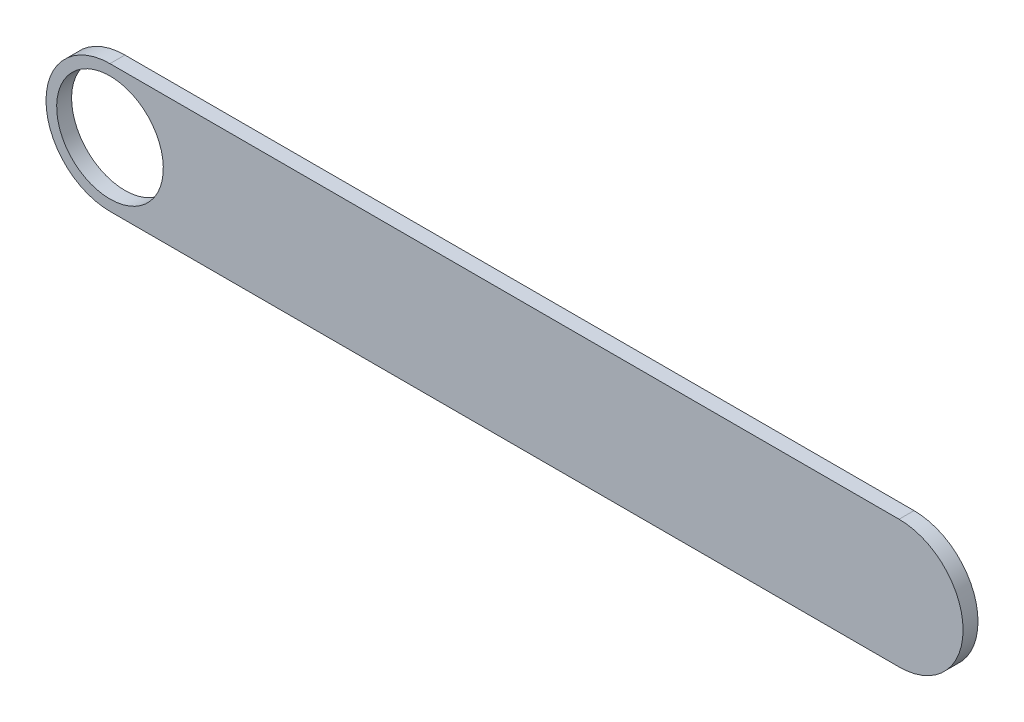
ISO-10303-21;
HEADER;
FILE_DESCRIPTION(('STEP AP214'),'2;1');
FILE_NAME('part.step','',(''),(''),'','','');
FILE_SCHEMA(('AUTOMOTIVE_DESIGN { 1 0 10303 214 1 1 1 1 }'));
ENDSEC;
DATA;
#1=APPLICATION_CONTEXT('core data for automotive mechanical design processes');
#2=APPLICATION_PROTOCOL_DEFINITION('international standard','automotive_design',2000,#1);
#3=PRODUCT_CONTEXT('',#1,'mechanical');
#4=PRODUCT('Part','Part','',(#3));
#5=PRODUCT_RELATED_PRODUCT_CATEGORY('part','',(#4));
#6=PRODUCT_DEFINITION_FORMATION('','',#4);
#7=PRODUCT_DEFINITION_CONTEXT('part definition',#1,'design');
#8=PRODUCT_DEFINITION('design','',#6,#7);
#9=PRODUCT_DEFINITION_SHAPE('','',#8);
#10=(LENGTH_UNIT() NAMED_UNIT(*) SI_UNIT(.MILLI.,.METRE.));
#11=(NAMED_UNIT(*) PLANE_ANGLE_UNIT() SI_UNIT($,.RADIAN.));
#12=(NAMED_UNIT(*) SI_UNIT($,.STERADIAN.) SOLID_ANGLE_UNIT());
#13=UNCERTAINTY_MEASURE_WITH_UNIT(LENGTH_MEASURE(1.E-05),#10,'distance_accuracy_value','');
#14=(GEOMETRIC_REPRESENTATION_CONTEXT(3) GLOBAL_UNCERTAINTY_ASSIGNED_CONTEXT((#13)) GLOBAL_UNIT_ASSIGNED_CONTEXT((#10,
#11,#12)) REPRESENTATION_CONTEXT('',''));
#15=CARTESIAN_POINT('',(0.,0.,0.));
#16=DIRECTION('',(0.,0.,1.));
#17=DIRECTION('',(1.,0.,0.));
#18=AXIS2_PLACEMENT_3D('',#15,#16,#17);
#19=CARTESIAN_POINT('',(131.41,-124.96,-0.045));
#20=DIRECTION('',(0.,0.,-1.));
#21=DIRECTION('',(0.,-1.,0.));
#22=AXIS2_PLACEMENT_3D('',#19,#20,#21);
#23=CYLINDRICAL_SURFACE('',#22,0.125);
#24=CARTESIAN_POINT('',(131.41,-124.96,-0.035));
#25=DIRECTION('',(0.,0.,-1.));
#26=DIRECTION('',(0.,-1.,0.));
#27=AXIS2_PLACEMENT_3D('',#24,#25,#26);
#28=CIRCLE('',#27,0.125);
#29=CARTESIAN_POINT('',(131.41,-125.085,-0.035));
#30=VERTEX_POINT('',#29);
#31=EDGE_CURVE('E122',#30,#30,#28,.T.);
#32=ORIENTED_EDGE('',*,*,#31,.T.);
#33=DIRECTION('',(0.,0.,1.));
#34=VECTOR('',#33,1.);
#35=CARTESIAN_POINT('',(131.41,-125.085,-0.045));
#36=LINE('',#35,#34);
#37=CARTESIAN_POINT('',(131.41,-125.085,0.));
#38=VERTEX_POINT('',#37);
#39=EDGE_CURVE('E11',#30,#38,#36,.T.);
#40=ORIENTED_EDGE('',*,*,#39,.T.);
#41=CARTESIAN_POINT('',(131.41,-124.96,0.));
#42=DIRECTION('',(0.,0.,-1.));
#43=DIRECTION('',(0.,-1.,0.));
#44=AXIS2_PLACEMENT_3D('',#41,#42,#43);
#45=CIRCLE('',#44,0.125);
#46=EDGE_CURVE('E25',#38,#38,#45,.T.);
#47=ORIENTED_EDGE('',*,*,#46,.F.);
#48=ORIENTED_EDGE('',*,*,#39,.F.);
#49=EDGE_LOOP('',(#32,#40,#47,#48));
#50=FACE_BOUND('',#49,.T.);
#51=ADVANCED_FACE('F17',(#50),#23,.F.);
#52=CARTESIAN_POINT('',(131.41,-125.11,-0.035));
#53=DIRECTION('',(0.,1.,0.));
#54=DIRECTION('',(1.,0.,0.));
#55=AXIS2_PLACEMENT_3D('',#52,#53,#54);
#56=PLANE('',#55);
#57=DIRECTION('',(1.,0.,0.));
#58=VECTOR('',#57,1.);
#59=CARTESIAN_POINT('',(131.41,-125.11,-0.035));
#60=LINE('',#59,#58);
#61=CARTESIAN_POINT('',(131.41,-125.11,-0.035));
#62=VERTEX_POINT('',#61);
#63=CARTESIAN_POINT('',(133.26,-125.11,-0.035));
#64=VERTEX_POINT('',#63);
#65=EDGE_CURVE('E118',#62,#64,#60,.T.);
#66=ORIENTED_EDGE('',*,*,#65,.T.);
#67=DIRECTION('',(0.,0.,1.));
#68=VECTOR('',#67,1.);
#69=CARTESIAN_POINT('',(133.26,-125.11,-0.035));
#70=LINE('',#69,#68);
#71=CARTESIAN_POINT('',(133.26,-125.11,0.));
#72=VERTEX_POINT('',#71);
#73=EDGE_CURVE('E83',#64,#72,#70,.T.);
#74=ORIENTED_EDGE('',*,*,#73,.T.);
#75=DIRECTION('',(1.,0.,0.));
#76=VECTOR('',#75,1.);
#77=CARTESIAN_POINT('',(131.41,-125.11,0.));
#78=LINE('',#77,#76);
#79=CARTESIAN_POINT('',(131.41,-125.11,0.));
#80=VERTEX_POINT('',#79);
#81=EDGE_CURVE('E125',#80,#72,#78,.T.);
#82=ORIENTED_EDGE('',*,*,#81,.F.);
#83=DIRECTION('',(0.,0.,1.));
#84=VECTOR('',#83,1.);
#85=CARTESIAN_POINT('',(131.41,-125.11,-0.035));
#86=LINE('',#85,#84);
#87=EDGE_CURVE('E119',#62,#80,#86,.T.);
#88=ORIENTED_EDGE('',*,*,#87,.F.);
#89=EDGE_LOOP('',(#66,#74,#82,#88));
#90=FACE_BOUND('',#89,.T.);
#91=ADVANCED_FACE('F142',(#90),#56,.F.);
#92=CARTESIAN_POINT('',(133.26,-124.81,0.));
#93=DIRECTION('',(0.,0.,1.));
#94=DIRECTION('',(1.,0.,0.));
#95=AXIS2_PLACEMENT_3D('',#92,#93,#94);
#96=PLANE('',#95);
#97=ORIENTED_EDGE('',*,*,#46,.T.);
#98=EDGE_LOOP('',(#97));
#99=FACE_BOUND('',#98,.T.);
#100=DIRECTION('',(-1.,0.,0.));
#101=VECTOR('',#100,1.);
#102=CARTESIAN_POINT('',(133.26,-124.81,0.));
#103=LINE('',#102,#101);
#104=CARTESIAN_POINT('',(133.26,-124.81,0.));
#105=VERTEX_POINT('',#104);
#106=CARTESIAN_POINT('',(131.41,-124.81,0.));
#107=VERTEX_POINT('',#106);
#108=EDGE_CURVE('E95',#105,#107,#103,.T.);
#109=ORIENTED_EDGE('',*,*,#108,.T.);
#110=CARTESIAN_POINT('',(131.41,-124.96,0.));
#111=DIRECTION('',(0.,0.,1.));
#112=DIRECTION('',(1.894780628694E-13,1.,0.));
#113=AXIS2_PLACEMENT_3D('',#110,#111,#112);
#114=CIRCLE('',#113,0.15);
#115=EDGE_CURVE('E114',#107,#80,#114,.T.);
#116=ORIENTED_EDGE('',*,*,#115,.T.);
#117=ORIENTED_EDGE('',*,*,#81,.T.);
#118=CARTESIAN_POINT('',(133.26,-124.96,0.));
#119=DIRECTION('',(0.,0.,1.));
#120=DIRECTION('',(0.,-1.,0.));
#121=AXIS2_PLACEMENT_3D('',#118,#119,#120);
#122=CIRCLE('',#121,0.15);
#123=EDGE_CURVE('E87',#72,#105,#122,.T.);
#124=ORIENTED_EDGE('',*,*,#123,.T.);
#125=EDGE_LOOP('',(#109,#116,#117,#124));
#126=FACE_BOUND('',#125,.T.);
#127=ADVANCED_FACE('F138',(#99,#126),#96,.T.);
#128=CARTESIAN_POINT('',(133.26,-124.81,-0.035));
#129=DIRECTION('',(0.,0.,1.));
#130=DIRECTION('',(1.,0.,0.));
#131=AXIS2_PLACEMENT_3D('',#128,#129,#130);
#132=PLANE('',#131);
#133=ORIENTED_EDGE('',*,*,#31,.F.);
#134=EDGE_LOOP('',(#133));
#135=FACE_BOUND('',#134,.T.);
#136=CARTESIAN_POINT('',(133.26,-124.96,-0.035));
#137=DIRECTION('',(0.,0.,1.));
#138=DIRECTION('',(0.,-1.,0.));
#139=AXIS2_PLACEMENT_3D('',#136,#137,#138);
#140=CIRCLE('',#139,0.15);
#141=CARTESIAN_POINT('',(133.26,-124.81,-0.035));
#142=VERTEX_POINT('',#141);
#143=EDGE_CURVE('E76',#64,#142,#140,.T.);
#144=ORIENTED_EDGE('',*,*,#143,.F.);
#145=ORIENTED_EDGE('',*,*,#65,.F.);
#146=CARTESIAN_POINT('',(131.41,-124.96,-0.035));
#147=DIRECTION('',(0.,0.,1.));
#148=DIRECTION('',(1.894780628694E-13,1.,0.));
#149=AXIS2_PLACEMENT_3D('',#146,#147,#148);
#150=CIRCLE('',#149,0.15);
#151=CARTESIAN_POINT('',(131.41,-124.81,-0.035));
#152=VERTEX_POINT('',#151);
#153=EDGE_CURVE('E100',#152,#62,#150,.T.);
#154=ORIENTED_EDGE('',*,*,#153,.F.);
#155=DIRECTION('',(-1.,0.,0.));
#156=VECTOR('',#155,1.);
#157=CARTESIAN_POINT('',(133.26,-124.81,-0.035));
#158=LINE('',#157,#156);
#159=EDGE_CURVE('E93',#142,#152,#158,.T.);
#160=ORIENTED_EDGE('',*,*,#159,.F.);
#161=EDGE_LOOP('',(#144,#145,#154,#160));
#162=FACE_BOUND('',#161,.T.);
#163=ADVANCED_FACE('F98',(#135,#162),#132,.F.);
#164=CARTESIAN_POINT('',(131.41,-124.96,-0.035));
#165=DIRECTION('',(0.,0.,-1.));
#166=DIRECTION('',(1.894780628694E-13,1.,0.));
#167=AXIS2_PLACEMENT_3D('',#164,#165,#166);
#168=CYLINDRICAL_SURFACE('',#167,0.15);
#169=ORIENTED_EDGE('',*,*,#153,.T.);
#170=ORIENTED_EDGE('',*,*,#87,.T.);
#171=ORIENTED_EDGE('',*,*,#115,.F.);
#172=DIRECTION('',(0.,0.,1.));
#173=VECTOR('',#172,1.);
#174=CARTESIAN_POINT('',(131.41,-124.81,-0.035));
#175=LINE('',#174,#173);
#176=EDGE_CURVE('E103',#152,#107,#175,.T.);
#177=ORIENTED_EDGE('',*,*,#176,.F.);
#178=EDGE_LOOP('',(#169,#170,#171,#177));
#179=FACE_BOUND('',#178,.T.);
#180=ADVANCED_FACE('F157',(#179),#168,.T.);
#181=CARTESIAN_POINT('',(133.26,-124.96,-0.035));
#182=DIRECTION('',(0.,0.,-1.));
#183=DIRECTION('',(0.,-1.,0.));
#184=AXIS2_PLACEMENT_3D('',#181,#182,#183);
#185=CYLINDRICAL_SURFACE('',#184,0.15);
#186=ORIENTED_EDGE('',*,*,#143,.T.);
#187=DIRECTION('',(0.,0.,1.));
#188=VECTOR('',#187,1.);
#189=CARTESIAN_POINT('',(133.26,-124.81,-0.035));
#190=LINE('',#189,#188);
#191=EDGE_CURVE('E80',#142,#105,#190,.T.);
#192=ORIENTED_EDGE('',*,*,#191,.T.);
#193=ORIENTED_EDGE('',*,*,#123,.F.);
#194=ORIENTED_EDGE('',*,*,#73,.F.);
#195=EDGE_LOOP('',(#186,#192,#193,#194));
#196=FACE_BOUND('',#195,.T.);
#197=ADVANCED_FACE('F78',(#196),#185,.T.);
#198=CARTESIAN_POINT('',(133.26,-124.81,-0.035));
#199=DIRECTION('',(0.,-1.,0.));
#200=DIRECTION('',(0.,0.,-1.));
#201=AXIS2_PLACEMENT_3D('',#198,#199,#200);
#202=PLANE('',#201);
#203=ORIENTED_EDGE('',*,*,#159,.T.);
#204=ORIENTED_EDGE('',*,*,#176,.T.);
#205=ORIENTED_EDGE('',*,*,#108,.F.);
#206=ORIENTED_EDGE('',*,*,#191,.F.);
#207=EDGE_LOOP('',(#203,#204,#205,#206));
#208=FACE_BOUND('',#207,.T.);
#209=ADVANCED_FACE('F91',(#208),#202,.F.);
#210=CLOSED_SHELL('',(#51,#91,#127,#163,#180,#197,#209));
#211=MANIFOLD_SOLID_BREP('B1',#210);
#212=ADVANCED_BREP_SHAPE_REPRESENTATION('',(#18,#211),#14);
#213=SHAPE_DEFINITION_REPRESENTATION(#9,#212);
ENDSEC;
END-ISO-10303-21;
